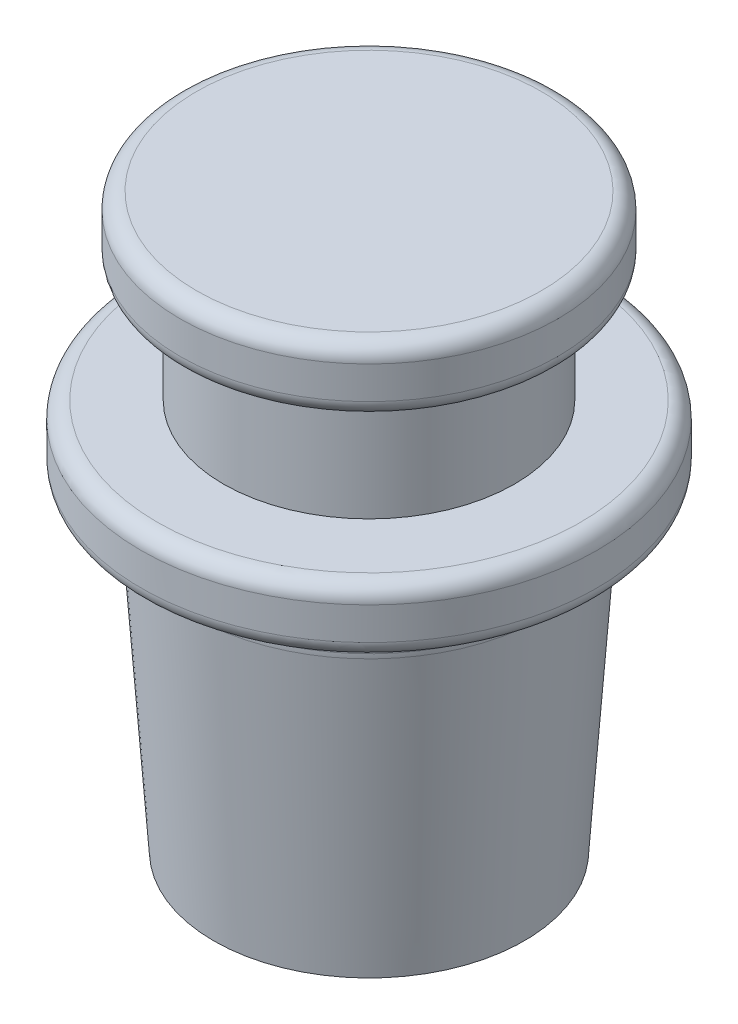
ISO-10303-21;
HEADER;
FILE_DESCRIPTION(('STEP AP214'),'2;1');
FILE_NAME('part.step','',(''),(''),'','','');
FILE_SCHEMA(('AUTOMOTIVE_DESIGN { 1 0 10303 214 1 1 1 1 }'));
ENDSEC;
DATA;
#1=APPLICATION_CONTEXT('core data for automotive mechanical design processes');
#2=APPLICATION_PROTOCOL_DEFINITION('international standard','automotive_design',2000,#1);
#3=PRODUCT_CONTEXT('',#1,'mechanical');
#4=PRODUCT('Part','Part','',(#3));
#5=PRODUCT_RELATED_PRODUCT_CATEGORY('part','',(#4));
#6=PRODUCT_DEFINITION_FORMATION('','',#4);
#7=PRODUCT_DEFINITION_CONTEXT('part definition',#1,'design');
#8=PRODUCT_DEFINITION('design','',#6,#7);
#9=PRODUCT_DEFINITION_SHAPE('','',#8);
#10=(LENGTH_UNIT() NAMED_UNIT(*) SI_UNIT(.MILLI.,.METRE.));
#11=(NAMED_UNIT(*) PLANE_ANGLE_UNIT() SI_UNIT($,.RADIAN.));
#12=(NAMED_UNIT(*) SI_UNIT($,.STERADIAN.) SOLID_ANGLE_UNIT());
#13=UNCERTAINTY_MEASURE_WITH_UNIT(LENGTH_MEASURE(1.E-05),#10,'distance_accuracy_value','');
#14=(GEOMETRIC_REPRESENTATION_CONTEXT(3) GLOBAL_UNCERTAINTY_ASSIGNED_CONTEXT((#13)) GLOBAL_UNIT_ASSIGNED_CONTEXT((#10,
#11,#12)) REPRESENTATION_CONTEXT('',''));
#15=CARTESIAN_POINT('',(0.,0.,0.));
#16=DIRECTION('',(0.,0.,1.));
#17=DIRECTION('',(1.,0.,0.));
#18=AXIS2_PLACEMENT_3D('',#15,#16,#17);
#19=CARTESIAN_POINT('',(0.,17.945298939448,0.));
#20=DIRECTION('',(0.,1.,0.));
#21=DIRECTION('',(0.,0.,1.));
#22=AXIS2_PLACEMENT_3D('',#19,#20,#21);
#23=PLANE('',#22);
#24=CARTESIAN_POINT('',(0.,17.945298939448,0.));
#25=DIRECTION('',(0.,1.,0.));
#26=DIRECTION('',(0.,0.,1.));
#27=AXIS2_PLACEMENT_3D('',#24,#25,#26);
#28=CIRCLE('',#27,2.65);
#29=CARTESIAN_POINT('',(0.,17.945298939448,2.65));
#30=VERTEX_POINT('',#29);
#31=EDGE_CURVE('E59',#30,#30,#28,.T.);
#32=ORIENTED_EDGE('',*,*,#31,.T.);
#33=EDGE_LOOP('',(#32));
#34=FACE_BOUND('',#33,.T.);
#35=ADVANCED_FACE('F30',(#34),#23,.T.);
#36=CARTESIAN_POINT('',(0.,-16.038041176324,0.));
#37=DIRECTION('',(0.,-1.,0.));
#38=DIRECTION('',(0.,0.,-1.));
#39=AXIS2_PLACEMENT_3D('',#36,#37,#38);
#40=CYLINDRICAL_SURFACE('',#39,2.9);
#41=CARTESIAN_POINT('',(0.,17.195298939448,0.));
#42=DIRECTION('',(0.,-1.,0.));
#43=DIRECTION('',(0.,0.,-1.));
#44=AXIS2_PLACEMENT_3D('',#41,#42,#43);
#45=CIRCLE('',#44,2.9);
#46=CARTESIAN_POINT('',(0.,17.195298939448,-2.9));
#47=VERTEX_POINT('',#46);
#48=EDGE_CURVE('E62',#47,#47,#45,.F.);
#49=ORIENTED_EDGE('',*,*,#48,.T.);
#50=EDGE_LOOP('',(#49));
#51=FACE_BOUND('',#50,.T.);
#52=CARTESIAN_POINT('',(0.,17.695298939448,0.));
#53=DIRECTION('',(0.,1.,0.));
#54=DIRECTION('',(0.,0.,1.));
#55=AXIS2_PLACEMENT_3D('',#52,#53,#54);
#56=CIRCLE('',#55,2.9);
#57=CARTESIAN_POINT('',(0.,17.695298939448,2.9));
#58=VERTEX_POINT('',#57);
#59=EDGE_CURVE('E65',#58,#58,#56,.F.);
#60=ORIENTED_EDGE('',*,*,#59,.T.);
#61=EDGE_LOOP('',(#60));
#62=FACE_BOUND('',#61,.T.);
#63=ADVANCED_FACE('F100',(#51,#62),#40,.T.);
#64=CARTESIAN_POINT('',(2.9,16.945298939448,0.));
#65=DIRECTION('',(0.,-1.,0.));
#66=DIRECTION('',(0.,0.,-1.));
#67=AXIS2_PLACEMENT_3D('',#64,#65,#66);
#68=PLANE('',#67);
#69=CARTESIAN_POINT('',(0.,16.945298939448,0.));
#70=DIRECTION('',(0.,-1.,0.));
#71=DIRECTION('',(0.,0.,-1.));
#72=AXIS2_PLACEMENT_3D('',#69,#70,#71);
#73=CIRCLE('',#72,2.485);
#74=CARTESIAN_POINT('',(0.,16.945298939448,-2.485));
#75=VERTEX_POINT('',#74);
#76=EDGE_CURVE('E10',#75,#75,#73,.F.);
#77=ORIENTED_EDGE('',*,*,#76,.T.);
#78=EDGE_LOOP('',(#77));
#79=FACE_BOUND('',#78,.T.);
#80=CARTESIAN_POINT('',(0.,16.945298939448,0.));
#81=DIRECTION('',(0.,-1.,0.));
#82=DIRECTION('',(0.,0.,-1.));
#83=AXIS2_PLACEMENT_3D('',#80,#81,#82);
#84=CIRCLE('',#83,2.65);
#85=CARTESIAN_POINT('',(0.,16.945298939448,-2.65));
#86=VERTEX_POINT('',#85);
#87=EDGE_CURVE('E68',#86,#86,#84,.T.);
#88=ORIENTED_EDGE('',*,*,#87,.T.);
#89=EDGE_LOOP('',(#88));
#90=FACE_BOUND('',#89,.T.);
#91=ADVANCED_FACE('F91',(#79,#90),#68,.T.);
#92=CARTESIAN_POINT('',(0.,-16.038041176324,0.));
#93=DIRECTION('',(0.,-1.,0.));
#94=DIRECTION('',(0.,0.,-1.));
#95=AXIS2_PLACEMENT_3D('',#92,#93,#94);
#96=CYLINDRICAL_SURFACE('',#95,2.235);
#97=CARTESIAN_POINT('',(0.,16.695298939448,0.));
#98=DIRECTION('',(0.,-1.,0.));
#99=DIRECTION('',(0.,0.,-1.));
#100=AXIS2_PLACEMENT_3D('',#97,#98,#99);
#101=CIRCLE('',#100,2.235);
#102=CARTESIAN_POINT('',(0.,16.695298939448,-2.235));
#103=VERTEX_POINT('',#102);
#104=EDGE_CURVE('E37',#103,#103,#101,.T.);
#105=ORIENTED_EDGE('',*,*,#104,.T.);
#106=EDGE_LOOP('',(#105));
#107=FACE_BOUND('',#106,.T.);
#108=CARTESIAN_POINT('',(0.,15.165298939448,0.));
#109=DIRECTION('',(0.,-1.,0.));
#110=DIRECTION('',(0.,0.,-1.));
#111=AXIS2_PLACEMENT_3D('',#108,#109,#110);
#112=CIRCLE('',#111,2.235);
#113=CARTESIAN_POINT('',(0.,15.165298939448,-2.235));
#114=VERTEX_POINT('',#113);
#115=EDGE_CURVE('E83',#114,#114,#112,.T.);
#116=ORIENTED_EDGE('',*,*,#115,.F.);
#117=EDGE_LOOP('',(#116));
#118=FACE_BOUND('',#117,.T.);
#119=ADVANCED_FACE('F89',(#107,#118),#96,.T.);
#120=CARTESIAN_POINT('',(2.235,15.165298939448,0.));
#121=DIRECTION('',(0.,1.,0.));
#122=DIRECTION('',(0.,0.,1.));
#123=AXIS2_PLACEMENT_3D('',#120,#121,#122);
#124=PLANE('',#123);
#125=CARTESIAN_POINT('',(0.,15.165298939448,0.));
#126=DIRECTION('',(0.,1.,0.));
#127=DIRECTION('',(0.,0.,1.));
#128=AXIS2_PLACEMENT_3D('',#125,#126,#127);
#129=CIRCLE('',#128,3.25);
#130=CARTESIAN_POINT('',(0.,15.165298939448,3.25));
#131=VERTEX_POINT('',#130);
#132=EDGE_CURVE('E71',#131,#131,#129,.T.);
#133=ORIENTED_EDGE('',*,*,#132,.T.);
#134=EDGE_LOOP('',(#133));
#135=FACE_BOUND('',#134,.T.);
#136=ORIENTED_EDGE('',*,*,#115,.T.);
#137=EDGE_LOOP('',(#136));
#138=FACE_BOUND('',#137,.T.);
#139=ADVANCED_FACE('F87',(#135,#138),#124,.T.);
#140=CARTESIAN_POINT('',(0.,-16.038041176324,0.));
#141=DIRECTION('',(0.,-1.,0.));
#142=DIRECTION('',(0.,0.,-1.));
#143=AXIS2_PLACEMENT_3D('',#140,#141,#142);
#144=CYLINDRICAL_SURFACE('',#143,3.5);
#145=CARTESIAN_POINT('',(0.,14.415298939448,0.));
#146=DIRECTION('',(0.,-1.,0.));
#147=DIRECTION('',(0.,0.,-1.));
#148=AXIS2_PLACEMENT_3D('',#145,#146,#147);
#149=CIRCLE('',#148,3.5);
#150=CARTESIAN_POINT('',(0.,14.415298939448,-3.5));
#151=VERTEX_POINT('',#150);
#152=EDGE_CURVE('E74',#151,#151,#149,.F.);
#153=ORIENTED_EDGE('',*,*,#152,.T.);
#154=EDGE_LOOP('',(#153));
#155=FACE_BOUND('',#154,.T.);
#156=CARTESIAN_POINT('',(0.,14.915298939448,0.));
#157=DIRECTION('',(0.,1.,0.));
#158=DIRECTION('',(0.,0.,1.));
#159=AXIS2_PLACEMENT_3D('',#156,#157,#158);
#160=CIRCLE('',#159,3.5);
#161=CARTESIAN_POINT('',(0.,14.915298939448,3.5));
#162=VERTEX_POINT('',#161);
#163=EDGE_CURVE('E77',#162,#162,#160,.F.);
#164=ORIENTED_EDGE('',*,*,#163,.T.);
#165=EDGE_LOOP('',(#164));
#166=FACE_BOUND('',#165,.T.);
#167=ADVANCED_FACE('F97',(#155,#166),#144,.T.);
#168=CARTESIAN_POINT('',(3.5,14.165298939448,0.));
#169=DIRECTION('',(0.,-1.,0.));
#170=DIRECTION('',(0.,0.,-1.));
#171=AXIS2_PLACEMENT_3D('',#168,#169,#170);
#172=PLANE('',#171);
#173=CARTESIAN_POINT('',(0.,14.165298939448,0.));
#174=DIRECTION('',(0.,-1.,0.));
#175=DIRECTION('',(0.,0.,-1.));
#176=AXIS2_PLACEMENT_3D('',#173,#174,#175);
#177=CIRCLE('',#176,2.95);
#178=CARTESIAN_POINT('',(0.,14.165298939448,-2.95));
#179=VERTEX_POINT('',#178);
#180=EDGE_CURVE('E53',#179,#179,#177,.F.);
#181=ORIENTED_EDGE('',*,*,#180,.T.);
#182=EDGE_LOOP('',(#181));
#183=FACE_BOUND('',#182,.T.);
#184=CARTESIAN_POINT('',(0.,14.165298939448,0.));
#185=DIRECTION('',(0.,-1.,0.));
#186=DIRECTION('',(0.,0.,-1.));
#187=AXIS2_PLACEMENT_3D('',#184,#185,#186);
#188=CIRCLE('',#187,3.25);
#189=CARTESIAN_POINT('',(0.,14.165298939448,-3.25));
#190=VERTEX_POINT('',#189);
#191=EDGE_CURVE('E80',#190,#190,#188,.T.);
#192=ORIENTED_EDGE('',*,*,#191,.T.);
#193=EDGE_LOOP('',(#192));
#194=FACE_BOUND('',#193,.T.);
#195=ADVANCED_FACE('F149',(#183,#194),#172,.T.);
#196=CARTESIAN_POINT('',(0.,-16.038041176324,0.));
#197=DIRECTION('',(0.,-1.,0.));
#198=DIRECTION('',(0.,0.,-1.));
#199=AXIS2_PLACEMENT_3D('',#196,#197,#198);
#200=CYLINDRICAL_SURFACE('',#199,2.7);
#201=CARTESIAN_POINT('',(0.,13.7002197089407,0.));
#202=DIRECTION('',(0.,-1.,0.));
#203=DIRECTION('',(0.,0.,-1.));
#204=AXIS2_PLACEMENT_3D('',#201,#202,#203);
#205=CIRCLE('',#204,2.7);
#206=CARTESIAN_POINT('',(0.,13.7002197089407,-2.7));
#207=VERTEX_POINT('',#206);
#208=EDGE_CURVE('E45',#207,#207,#205,.F.);
#209=ORIENTED_EDGE('',*,*,#208,.T.);
#210=EDGE_LOOP('',(#209));
#211=FACE_BOUND('',#210,.T.);
#212=CARTESIAN_POINT('',(0.,13.915298939448,0.));
#213=DIRECTION('',(0.,-1.,0.));
#214=DIRECTION('',(0.,0.,-1.));
#215=AXIS2_PLACEMENT_3D('',#212,#213,#214);
#216=CIRCLE('',#215,2.7);
#217=CARTESIAN_POINT('',(0.,13.915298939448,-2.7));
#218=VERTEX_POINT('',#217);
#219=EDGE_CURVE('E56',#218,#218,#216,.T.);
#220=ORIENTED_EDGE('',*,*,#219,.T.);
#221=EDGE_LOOP('',(#220));
#222=FACE_BOUND('',#221,.T.);
#223=ADVANCED_FACE('F146',(#211,#222),#200,.T.);
#224=CARTESIAN_POINT('',(2.7,9.16529893944802,0.));
#225=DIRECTION('',(0.,-1.,0.));
#226=DIRECTION('',(0.,0.,-1.));
#227=AXIS2_PLACEMENT_3D('',#224,#225,#226);
#228=PLANE('',#227);
#229=CARTESIAN_POINT('',(0.,9.16529893944802,0.));
#230=DIRECTION('',(0.,-1.,0.));
#231=DIRECTION('',(0.,0.,-1.));
#232=AXIS2_PLACEMENT_3D('',#229,#230,#231);
#233=CIRCLE('',#232,2.38532934625415);
#234=CARTESIAN_POINT('',(0.,9.16529893944802,-2.38532934625415));
#235=VERTEX_POINT('',#234);
#236=EDGE_CURVE('E50',#235,#235,#233,.T.);
#237=ORIENTED_EDGE('',*,*,#236,.T.);
#238=EDGE_LOOP('',(#237));
#239=FACE_BOUND('',#238,.T.);
#240=ADVANCED_FACE('F115',(#239),#228,.T.);
#241=CARTESIAN_POINT('',(0.,14.415298939448,0.));
#242=DIRECTION('',(0.,-1.,0.));
#243=DIRECTION('',(0.,0.,-1.));
#244=AXIS2_PLACEMENT_3D('',#241,#242,#243);
#245=TOROIDAL_SURFACE('',#244,3.25,0.25);
#246=ORIENTED_EDGE('',*,*,#152,.F.);
#247=EDGE_LOOP('',(#246));
#248=FACE_BOUND('',#247,.T.);
#249=ORIENTED_EDGE('',*,*,#191,.F.);
#250=EDGE_LOOP('',(#249));
#251=FACE_BOUND('',#250,.T.);
#252=ADVANCED_FACE('F111',(#248,#251),#245,.T.);
#253=CARTESIAN_POINT('',(0.,14.915298939448,0.));
#254=DIRECTION('',(0.,1.,0.));
#255=DIRECTION('',(0.,0.,1.));
#256=AXIS2_PLACEMENT_3D('',#253,#254,#255);
#257=TOROIDAL_SURFACE('',#256,3.25,0.25);
#258=ORIENTED_EDGE('',*,*,#132,.F.);
#259=EDGE_LOOP('',(#258));
#260=FACE_BOUND('',#259,.T.);
#261=ORIENTED_EDGE('',*,*,#163,.F.);
#262=EDGE_LOOP('',(#261));
#263=FACE_BOUND('',#262,.T.);
#264=ADVANCED_FACE('F114',(#260,#263),#257,.T.);
#265=CARTESIAN_POINT('',(0.,17.195298939448,0.));
#266=DIRECTION('',(0.,-1.,0.));
#267=DIRECTION('',(0.,0.,-1.));
#268=AXIS2_PLACEMENT_3D('',#265,#266,#267);
#269=TOROIDAL_SURFACE('',#268,2.65,0.25);
#270=ORIENTED_EDGE('',*,*,#48,.F.);
#271=EDGE_LOOP('',(#270));
#272=FACE_BOUND('',#271,.T.);
#273=ORIENTED_EDGE('',*,*,#87,.F.);
#274=EDGE_LOOP('',(#273));
#275=FACE_BOUND('',#274,.T.);
#276=ADVANCED_FACE('F119',(#272,#275),#269,.T.);
#277=CARTESIAN_POINT('',(0.,17.695298939448,0.));
#278=DIRECTION('',(0.,1.,0.));
#279=DIRECTION('',(0.,0.,1.));
#280=AXIS2_PLACEMENT_3D('',#277,#278,#279);
#281=TOROIDAL_SURFACE('',#280,2.65,0.25);
#282=ORIENTED_EDGE('',*,*,#31,.F.);
#283=EDGE_LOOP('',(#282));
#284=FACE_BOUND('',#283,.T.);
#285=ORIENTED_EDGE('',*,*,#59,.F.);
#286=EDGE_LOOP('',(#285));
#287=FACE_BOUND('',#286,.T.);
#288=ADVANCED_FACE('F123',(#284,#287),#281,.T.);
#289=CARTESIAN_POINT('',(0.,13.915298939448,0.));
#290=DIRECTION('',(0.,-1.,0.));
#291=DIRECTION('',(0.,0.,-1.));
#292=AXIS2_PLACEMENT_3D('',#289,#290,#291);
#293=TOROIDAL_SURFACE('',#292,2.95,0.25);
#294=ORIENTED_EDGE('',*,*,#180,.F.);
#295=EDGE_LOOP('',(#294));
#296=FACE_BOUND('',#295,.T.);
#297=ORIENTED_EDGE('',*,*,#219,.F.);
#298=EDGE_LOOP('',(#297));
#299=FACE_BOUND('',#298,.T.);
#300=ADVANCED_FACE('F127',(#296,#299),#293,.F.);
#301=CARTESIAN_POINT('',(0.,9.16529893944802,0.));
#302=DIRECTION('',(0.,1.,0.));
#303=DIRECTION('',(0.,0.,1.));
#304=AXIS2_PLACEMENT_3D('',#301,#302,#303);
#305=CONICAL_SURFACE('',#304,2.38532934625415,0.0698131700797708);
#306=CARTESIAN_POINT('',(0.,13.6304632351965,0.));
#307=DIRECTION('',(0.,-1.,0.));
#308=DIRECTION('',(0.,0.,-1.));
#309=AXIS2_PLACEMENT_3D('',#306,#307,#308);
#310=CIRCLE('',#309,2.69756405025982);
#311=CARTESIAN_POINT('',(0.,13.6304632351965,-2.69756405025982));
#312=VERTEX_POINT('',#311);
#313=EDGE_CURVE('E41',#312,#312,#310,.T.);
#314=ORIENTED_EDGE('',*,*,#313,.T.);
#315=EDGE_LOOP('',(#314));
#316=FACE_BOUND('',#315,.T.);
#317=ORIENTED_EDGE('',*,*,#236,.F.);
#318=EDGE_LOOP('',(#317));
#319=FACE_BOUND('',#318,.T.);
#320=ADVANCED_FACE('F131',(#316,#319),#305,.T.);
#321=CARTESIAN_POINT('',(0.,13.7002197089407,0.));
#322=DIRECTION('',(0.,-1.,0.));
#323=DIRECTION('',(0.,0.,-1.));
#324=AXIS2_PLACEMENT_3D('',#321,#322,#323);
#325=TOROIDAL_SURFACE('',#324,1.7,1.);
#326=ORIENTED_EDGE('',*,*,#313,.F.);
#327=EDGE_LOOP('',(#326));
#328=FACE_BOUND('',#327,.T.);
#329=ORIENTED_EDGE('',*,*,#208,.F.);
#330=EDGE_LOOP('',(#329));
#331=FACE_BOUND('',#330,.T.);
#332=ADVANCED_FACE('F134',(#328,#331),#325,.T.);
#333=CARTESIAN_POINT('',(0.,16.695298939448,0.));
#334=DIRECTION('',(0.,-1.,0.));
#335=DIRECTION('',(0.,0.,-1.));
#336=AXIS2_PLACEMENT_3D('',#333,#334,#335);
#337=TOROIDAL_SURFACE('',#336,2.485,0.25);
#338=ORIENTED_EDGE('',*,*,#76,.F.);
#339=EDGE_LOOP('',(#338));
#340=FACE_BOUND('',#339,.T.);
#341=ORIENTED_EDGE('',*,*,#104,.F.);
#342=EDGE_LOOP('',(#341));
#343=FACE_BOUND('',#342,.T.);
#344=ADVANCED_FACE('F32',(#340,#343),#337,.F.);
#345=CLOSED_SHELL('',(#35,#63,#91,#119,#139,#167,#195,#223,#240,#252,#264,#276,#288,#300,#320,
#332,#344));
#346=MANIFOLD_SOLID_BREP('B2',#345);
#347=ADVANCED_BREP_SHAPE_REPRESENTATION('',(#18,#346),#14);
#348=SHAPE_DEFINITION_REPRESENTATION(#9,#347);
ENDSEC;
END-ISO-10303-21;
